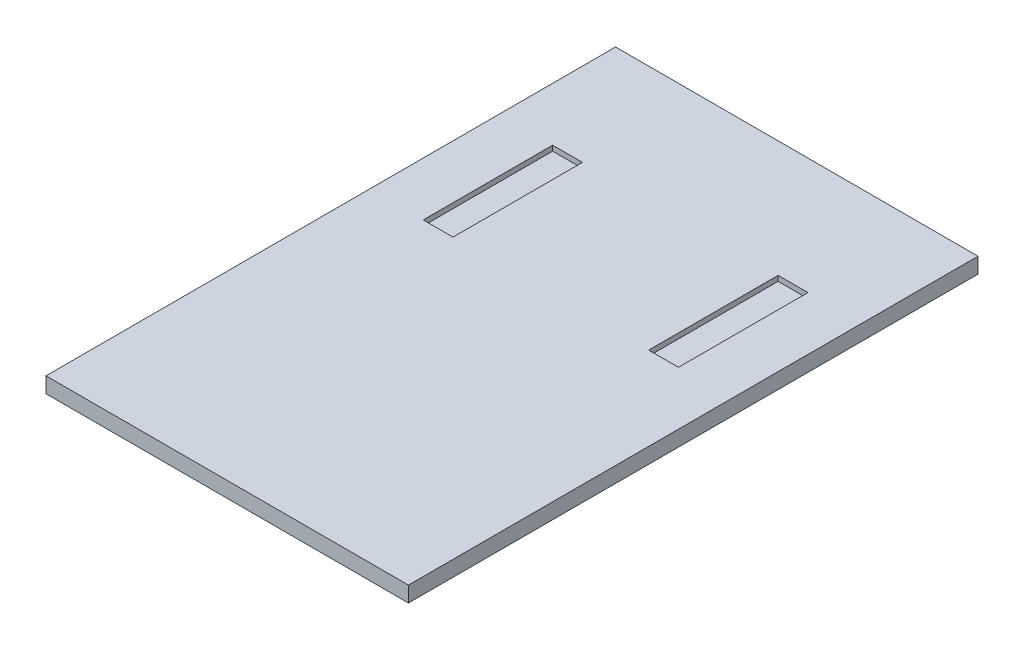
ISO-10303-21;
HEADER;
FILE_DESCRIPTION(('STEP AP214'),'2;1');
FILE_NAME('part.step','',(''),(''),'','','');
FILE_SCHEMA(('AUTOMOTIVE_DESIGN { 1 0 10303 214 1 1 1 1 }'));
ENDSEC;
DATA;
#1=APPLICATION_CONTEXT('core data for automotive mechanical design processes');
#2=APPLICATION_PROTOCOL_DEFINITION('international standard','automotive_design',2000,#1);
#3=PRODUCT_CONTEXT('',#1,'mechanical');
#4=PRODUCT('Part','Part','',(#3));
#5=PRODUCT_RELATED_PRODUCT_CATEGORY('part','',(#4));
#6=PRODUCT_DEFINITION_FORMATION('','',#4);
#7=PRODUCT_DEFINITION_CONTEXT('part definition',#1,'design');
#8=PRODUCT_DEFINITION('design','',#6,#7);
#9=PRODUCT_DEFINITION_SHAPE('','',#8);
#10=(LENGTH_UNIT() NAMED_UNIT(*) SI_UNIT(.MILLI.,.METRE.));
#11=(NAMED_UNIT(*) PLANE_ANGLE_UNIT() SI_UNIT($,.RADIAN.));
#12=(NAMED_UNIT(*) SI_UNIT($,.STERADIAN.) SOLID_ANGLE_UNIT());
#13=UNCERTAINTY_MEASURE_WITH_UNIT(LENGTH_MEASURE(1.E-05),#10,'distance_accuracy_value','');
#14=(GEOMETRIC_REPRESENTATION_CONTEXT(3) GLOBAL_UNCERTAINTY_ASSIGNED_CONTEXT((#13)) GLOBAL_UNIT_ASSIGNED_CONTEXT((#10,
#11,#12)) REPRESENTATION_CONTEXT('',''));
#15=CARTESIAN_POINT('',(0.,0.,0.));
#16=DIRECTION('',(0.,0.,1.));
#17=DIRECTION('',(1.,0.,0.));
#18=AXIS2_PLACEMENT_3D('',#15,#16,#17);
#19=CARTESIAN_POINT('',(889.,76.2,1397.));
#20=DIRECTION('',(-1.,0.,0.));
#21=DIRECTION('',(0.,0.,1.));
#22=AXIS2_PLACEMENT_3D('',#19,#20,#21);
#23=PLANE('',#22);
#24=DIRECTION('',(0.,0.,-1.));
#25=VECTOR('',#24,1.);
#26=CARTESIAN_POINT('',(889.,0.,1397.));
#27=LINE('',#26,#25);
#28=CARTESIAN_POINT('',(889.,0.,1397.));
#29=VERTEX_POINT('',#28);
#30=CARTESIAN_POINT('',(889.,0.,-1397.));
#31=VERTEX_POINT('',#30);
#32=EDGE_CURVE('E159',#29,#31,#27,.T.);
#33=ORIENTED_EDGE('',*,*,#32,.T.);
#34=DIRECTION('',(0.,-1.,0.));
#35=VECTOR('',#34,1.);
#36=CARTESIAN_POINT('',(889.,76.2,-1397.));
#37=LINE('',#36,#35);
#38=CARTESIAN_POINT('',(889.,76.2,-1397.));
#39=VERTEX_POINT('',#38);
#40=EDGE_CURVE('E11',#39,#31,#37,.T.);
#41=ORIENTED_EDGE('',*,*,#40,.F.);
#42=DIRECTION('',(0.,0.,-1.));
#43=VECTOR('',#42,1.);
#44=CARTESIAN_POINT('',(889.,76.2,1397.));
#45=LINE('',#44,#43);
#46=CARTESIAN_POINT('',(889.,76.2,1397.));
#47=VERTEX_POINT('',#46);
#48=EDGE_CURVE('E192',#47,#39,#45,.T.);
#49=ORIENTED_EDGE('',*,*,#48,.F.);
#50=DIRECTION('',(0.,-1.,0.));
#51=VECTOR('',#50,1.);
#52=CARTESIAN_POINT('',(889.,76.2,1397.));
#53=LINE('',#52,#51);
#54=EDGE_CURVE('E202',#47,#29,#53,.T.);
#55=ORIENTED_EDGE('',*,*,#54,.T.);
#56=EDGE_LOOP('',(#33,#41,#49,#55));
#57=FACE_BOUND('',#56,.T.);
#58=ADVANCED_FACE('F35',(#57),#23,.F.);
#59=CARTESIAN_POINT('',(-889.,76.2,-1397.));
#60=DIRECTION('',(0.,0.,1.));
#61=DIRECTION('',(1.,0.,0.));
#62=AXIS2_PLACEMENT_3D('',#59,#60,#61);
#63=PLANE('',#62);
#64=DIRECTION('',(-1.,0.,0.));
#65=VECTOR('',#64,1.);
#66=CARTESIAN_POINT('',(-889.,0.,-1397.));
#67=LINE('',#66,#65);
#68=CARTESIAN_POINT('',(-889.,0.,-1397.));
#69=VERTEX_POINT('',#68);
#70=EDGE_CURVE('E205',#31,#69,#67,.T.);
#71=ORIENTED_EDGE('',*,*,#70,.T.);
#72=DIRECTION('',(0.,-1.,0.));
#73=VECTOR('',#72,1.);
#74=CARTESIAN_POINT('',(-889.,76.2,-1397.));
#75=LINE('',#74,#73);
#76=CARTESIAN_POINT('',(-889.,76.2,-1397.));
#77=VERTEX_POINT('',#76);
#78=EDGE_CURVE('E42',#77,#69,#75,.T.);
#79=ORIENTED_EDGE('',*,*,#78,.F.);
#80=DIRECTION('',(-1.,0.,0.));
#81=VECTOR('',#80,1.);
#82=CARTESIAN_POINT('',(-889.,76.2,-1397.));
#83=LINE('',#82,#81);
#84=EDGE_CURVE('E195',#39,#77,#83,.T.);
#85=ORIENTED_EDGE('',*,*,#84,.F.);
#86=ORIENTED_EDGE('',*,*,#40,.T.);
#87=EDGE_LOOP('',(#71,#79,#85,#86));
#88=FACE_BOUND('',#87,.T.);
#89=ADVANCED_FACE('F235',(#88),#63,.F.);
#90=CARTESIAN_POINT('',(-889.,76.2,1397.));
#91=DIRECTION('',(1.,0.,0.));
#92=DIRECTION('',(0.,0.,-1.));
#93=AXIS2_PLACEMENT_3D('',#90,#91,#92);
#94=PLANE('',#93);
#95=DIRECTION('',(0.,0.,1.));
#96=VECTOR('',#95,1.);
#97=CARTESIAN_POINT('',(-889.,0.,1397.));
#98=LINE('',#97,#96);
#99=CARTESIAN_POINT('',(-889.,0.,1397.));
#100=VERTEX_POINT('',#99);
#101=EDGE_CURVE('E207',#69,#100,#98,.T.);
#102=ORIENTED_EDGE('',*,*,#101,.T.);
#103=DIRECTION('',(0.,-1.,0.));
#104=VECTOR('',#103,1.);
#105=CARTESIAN_POINT('',(-889.,76.2,1397.));
#106=LINE('',#105,#104);
#107=CARTESIAN_POINT('',(-889.,76.2,1397.));
#108=VERTEX_POINT('',#107);
#109=EDGE_CURVE('E212',#108,#100,#106,.T.);
#110=ORIENTED_EDGE('',*,*,#109,.F.);
#111=DIRECTION('',(0.,0.,1.));
#112=VECTOR('',#111,1.);
#113=CARTESIAN_POINT('',(-889.,76.2,1397.));
#114=LINE('',#113,#112);
#115=EDGE_CURVE('E198',#77,#108,#114,.T.);
#116=ORIENTED_EDGE('',*,*,#115,.F.);
#117=ORIENTED_EDGE('',*,*,#78,.T.);
#118=EDGE_LOOP('',(#102,#110,#116,#117));
#119=FACE_BOUND('',#118,.T.);
#120=ADVANCED_FACE('F219',(#119),#94,.F.);
#121=CARTESIAN_POINT('',(-889.,76.2,1397.));
#122=DIRECTION('',(0.,0.,-1.));
#123=DIRECTION('',(-1.,0.,0.));
#124=AXIS2_PLACEMENT_3D('',#121,#122,#123);
#125=PLANE('',#124);
#126=DIRECTION('',(1.,0.,0.));
#127=VECTOR('',#126,1.);
#128=CARTESIAN_POINT('',(-889.,0.,1397.));
#129=LINE('',#128,#127);
#130=EDGE_CURVE('E196',#100,#29,#129,.T.);
#131=ORIENTED_EDGE('',*,*,#130,.T.);
#132=ORIENTED_EDGE('',*,*,#54,.F.);
#133=DIRECTION('',(1.,0.,0.));
#134=VECTOR('',#133,1.);
#135=CARTESIAN_POINT('',(-889.,76.2,1397.));
#136=LINE('',#135,#134);
#137=EDGE_CURVE('E200',#108,#47,#136,.T.);
#138=ORIENTED_EDGE('',*,*,#137,.F.);
#139=ORIENTED_EDGE('',*,*,#109,.T.);
#140=EDGE_LOOP('',(#131,#132,#138,#139));
#141=FACE_BOUND('',#140,.T.);
#142=ADVANCED_FACE('F228',(#141),#125,.F.);
#143=CARTESIAN_POINT('',(0.,76.2,0.));
#144=DIRECTION('',(0.,-1.,0.));
#145=DIRECTION('',(0.,0.,-1.));
#146=AXIS2_PLACEMENT_3D('',#143,#144,#145);
#147=PLANE('',#146);
#148=DIRECTION('',(1.,0.,0.));
#149=VECTOR('',#148,1.);
#150=CARTESIAN_POINT('',(626.11,76.2,-190.5));
#151=LINE('',#150,#149);
#152=CARTESIAN_POINT('',(480.06,76.2,-190.5));
#153=VERTEX_POINT('',#152);
#154=CARTESIAN_POINT('',(626.11,76.2,-190.5));
#155=VERTEX_POINT('',#154);
#156=EDGE_CURVE('E152',#153,#155,#151,.T.);
#157=ORIENTED_EDGE('',*,*,#156,.F.);
#158=DIRECTION('',(0.,0.,1.));
#159=VECTOR('',#158,1.);
#160=CARTESIAN_POINT('',(480.06,76.2,-190.5));
#161=LINE('',#160,#159);
#162=CARTESIAN_POINT('',(480.06,76.2,-825.5));
#163=VERTEX_POINT('',#162);
#164=EDGE_CURVE('E49',#163,#153,#161,.T.);
#165=ORIENTED_EDGE('',*,*,#164,.F.);
#166=DIRECTION('',(-1.,0.,0.));
#167=VECTOR('',#166,1.);
#168=CARTESIAN_POINT('',(626.11,76.2,-825.5));
#169=LINE('',#168,#167);
#170=CARTESIAN_POINT('',(626.11,76.2,-825.5));
#171=VERTEX_POINT('',#170);
#172=EDGE_CURVE('E143',#171,#163,#169,.T.);
#173=ORIENTED_EDGE('',*,*,#172,.F.);
#174=DIRECTION('',(0.,0.,-1.));
#175=VECTOR('',#174,1.);
#176=CARTESIAN_POINT('',(626.11,76.2,-190.5));
#177=LINE('',#176,#175);
#178=EDGE_CURVE('E146',#155,#171,#177,.T.);
#179=ORIENTED_EDGE('',*,*,#178,.F.);
#180=EDGE_LOOP('',(#157,#165,#173,#179));
#181=FACE_BOUND('',#180,.T.);
#182=DIRECTION('',(1.,0.,0.));
#183=VECTOR('',#182,1.);
#184=CARTESIAN_POINT('',(-626.11,76.2,-190.5));
#185=LINE('',#184,#183);
#186=CARTESIAN_POINT('',(-626.11,76.2,-190.5));
#187=VERTEX_POINT('',#186);
#188=CARTESIAN_POINT('',(-480.06,76.2,-190.5));
#189=VERTEX_POINT('',#188);
#190=EDGE_CURVE('E178',#187,#189,#185,.T.);
#191=ORIENTED_EDGE('',*,*,#190,.F.);
#192=DIRECTION('',(0.,0.,1.));
#193=VECTOR('',#192,1.);
#194=CARTESIAN_POINT('',(-626.11,76.2,-190.5));
#195=LINE('',#194,#193);
#196=CARTESIAN_POINT('',(-626.11,76.2,-825.5));
#197=VERTEX_POINT('',#196);
#198=EDGE_CURVE('E57',#197,#187,#195,.T.);
#199=ORIENTED_EDGE('',*,*,#198,.F.);
#200=DIRECTION('',(-1.,0.,0.));
#201=VECTOR('',#200,1.);
#202=CARTESIAN_POINT('',(-626.11,76.2,-825.5));
#203=LINE('',#202,#201);
#204=CARTESIAN_POINT('',(-480.06,76.2,-825.5));
#205=VERTEX_POINT('',#204);
#206=EDGE_CURVE('E167',#205,#197,#203,.T.);
#207=ORIENTED_EDGE('',*,*,#206,.F.);
#208=DIRECTION('',(0.,0.,-1.));
#209=VECTOR('',#208,1.);
#210=CARTESIAN_POINT('',(-480.06,76.2,-190.5));
#211=LINE('',#210,#209);
#212=EDGE_CURVE('E181',#189,#205,#211,.T.);
#213=ORIENTED_EDGE('',*,*,#212,.F.);
#214=EDGE_LOOP('',(#191,#199,#207,#213));
#215=FACE_BOUND('',#214,.T.);
#216=ORIENTED_EDGE('',*,*,#48,.T.);
#217=ORIENTED_EDGE('',*,*,#84,.T.);
#218=ORIENTED_EDGE('',*,*,#115,.T.);
#219=ORIENTED_EDGE('',*,*,#137,.T.);
#220=EDGE_LOOP('',(#216,#217,#218,#219));
#221=FACE_BOUND('',#220,.T.);
#222=ADVANCED_FACE('F234',(#181,#215,#221),#147,.F.);
#223=CARTESIAN_POINT('',(0.,0.,0.));
#224=DIRECTION('',(0.,-1.,0.));
#225=DIRECTION('',(0.,0.,-1.));
#226=AXIS2_PLACEMENT_3D('',#223,#224,#225);
#227=PLANE('',#226);
#228=ORIENTED_EDGE('',*,*,#32,.F.);
#229=ORIENTED_EDGE('',*,*,#130,.F.);
#230=ORIENTED_EDGE('',*,*,#101,.F.);
#231=ORIENTED_EDGE('',*,*,#70,.F.);
#232=EDGE_LOOP('',(#228,#229,#230,#231));
#233=FACE_BOUND('',#232,.T.);
#234=ADVANCED_FACE('F225',(#233),#227,.T.);
#235=CARTESIAN_POINT('',(-626.11,50.8,-190.5));
#236=DIRECTION('',(-1.,0.,0.));
#237=DIRECTION('',(0.,0.,1.));
#238=AXIS2_PLACEMENT_3D('',#235,#236,#237);
#239=PLANE('',#238);
#240=ORIENTED_EDGE('',*,*,#198,.T.);
#241=DIRECTION('',(0.,1.,0.));
#242=VECTOR('',#241,1.);
#243=CARTESIAN_POINT('',(-626.11,50.8,-190.5));
#244=LINE('',#243,#242);
#245=CARTESIAN_POINT('',(-626.11,50.8,-190.5));
#246=VERTEX_POINT('',#245);
#247=EDGE_CURVE('E176',#246,#187,#244,.T.);
#248=ORIENTED_EDGE('',*,*,#247,.F.);
#249=DIRECTION('',(0.,0.,1.));
#250=VECTOR('',#249,1.);
#251=CARTESIAN_POINT('',(-626.11,50.8,-190.5));
#252=LINE('',#251,#250);
#253=CARTESIAN_POINT('',(-626.11,50.8,-825.5));
#254=VERTEX_POINT('',#253);
#255=EDGE_CURVE('E163',#254,#246,#252,.T.);
#256=ORIENTED_EDGE('',*,*,#255,.F.);
#257=DIRECTION('',(0.,1.,0.));
#258=VECTOR('',#257,1.);
#259=CARTESIAN_POINT('',(-626.11,50.8,-825.5));
#260=LINE('',#259,#258);
#261=EDGE_CURVE('E153',#254,#197,#260,.T.);
#262=ORIENTED_EDGE('',*,*,#261,.T.);
#263=EDGE_LOOP('',(#240,#248,#256,#262));
#264=FACE_BOUND('',#263,.T.);
#265=ADVANCED_FACE('F247',(#264),#239,.F.);
#266=CARTESIAN_POINT('',(-626.11,50.8,-825.5));
#267=DIRECTION('',(0.,0.,-1.));
#268=DIRECTION('',(-1.,0.,0.));
#269=AXIS2_PLACEMENT_3D('',#266,#267,#268);
#270=PLANE('',#269);
#271=ORIENTED_EDGE('',*,*,#206,.T.);
#272=ORIENTED_EDGE('',*,*,#261,.F.);
#273=DIRECTION('',(-1.,0.,0.));
#274=VECTOR('',#273,1.);
#275=CARTESIAN_POINT('',(-626.11,50.8,-825.5));
#276=LINE('',#275,#274);
#277=CARTESIAN_POINT('',(-480.06,50.8,-825.5));
#278=VERTEX_POINT('',#277);
#279=EDGE_CURVE('E173',#278,#254,#276,.T.);
#280=ORIENTED_EDGE('',*,*,#279,.F.);
#281=DIRECTION('',(0.,1.,0.));
#282=VECTOR('',#281,1.);
#283=CARTESIAN_POINT('',(-480.06,50.8,-825.5));
#284=LINE('',#283,#282);
#285=EDGE_CURVE('E187',#278,#205,#284,.T.);
#286=ORIENTED_EDGE('',*,*,#285,.T.);
#287=EDGE_LOOP('',(#271,#272,#280,#286));
#288=FACE_BOUND('',#287,.T.);
#289=ADVANCED_FACE('F253',(#288),#270,.F.);
#290=CARTESIAN_POINT('',(-480.06,50.8,-190.5));
#291=DIRECTION('',(1.,0.,0.));
#292=DIRECTION('',(0.,0.,-1.));
#293=AXIS2_PLACEMENT_3D('',#290,#291,#292);
#294=PLANE('',#293);
#295=ORIENTED_EDGE('',*,*,#212,.T.);
#296=ORIENTED_EDGE('',*,*,#285,.F.);
#297=DIRECTION('',(0.,0.,-1.));
#298=VECTOR('',#297,1.);
#299=CARTESIAN_POINT('',(-480.06,50.8,-190.5));
#300=LINE('',#299,#298);
#301=CARTESIAN_POINT('',(-480.06,50.8,-190.5));
#302=VERTEX_POINT('',#301);
#303=EDGE_CURVE('E170',#302,#278,#300,.T.);
#304=ORIENTED_EDGE('',*,*,#303,.F.);
#305=DIRECTION('',(0.,1.,0.));
#306=VECTOR('',#305,1.);
#307=CARTESIAN_POINT('',(-480.06,50.8,-190.5));
#308=LINE('',#307,#306);
#309=EDGE_CURVE('E189',#302,#189,#308,.T.);
#310=ORIENTED_EDGE('',*,*,#309,.T.);
#311=EDGE_LOOP('',(#295,#296,#304,#310));
#312=FACE_BOUND('',#311,.T.);
#313=ADVANCED_FACE('F258',(#312),#294,.F.);
#314=CARTESIAN_POINT('',(-626.11,50.8,-190.5));
#315=DIRECTION('',(0.,0.,1.));
#316=DIRECTION('',(1.,0.,0.));
#317=AXIS2_PLACEMENT_3D('',#314,#315,#316);
#318=PLANE('',#317);
#319=ORIENTED_EDGE('',*,*,#190,.T.);
#320=ORIENTED_EDGE('',*,*,#309,.F.);
#321=DIRECTION('',(1.,0.,0.));
#322=VECTOR('',#321,1.);
#323=CARTESIAN_POINT('',(-626.11,50.8,-190.5));
#324=LINE('',#323,#322);
#325=EDGE_CURVE('E166',#246,#302,#324,.T.);
#326=ORIENTED_EDGE('',*,*,#325,.F.);
#327=ORIENTED_EDGE('',*,*,#247,.T.);
#328=EDGE_LOOP('',(#319,#320,#326,#327));
#329=FACE_BOUND('',#328,.T.);
#330=ADVANCED_FACE('F254',(#329),#318,.F.);
#331=CARTESIAN_POINT('',(0.,50.8,0.));
#332=DIRECTION('',(0.,-1.,0.));
#333=DIRECTION('',(0.,0.,-1.));
#334=AXIS2_PLACEMENT_3D('',#331,#332,#333);
#335=PLANE('',#334);
#336=ORIENTED_EDGE('',*,*,#255,.T.);
#337=ORIENTED_EDGE('',*,*,#325,.T.);
#338=ORIENTED_EDGE('',*,*,#303,.T.);
#339=ORIENTED_EDGE('',*,*,#279,.T.);
#340=EDGE_LOOP('',(#336,#337,#338,#339));
#341=FACE_BOUND('',#340,.T.);
#342=ADVANCED_FACE('F257',(#341),#335,.F.);
#343=CARTESIAN_POINT('',(480.06,50.8,-190.5));
#344=DIRECTION('',(-1.,0.,0.));
#345=DIRECTION('',(0.,0.,1.));
#346=AXIS2_PLACEMENT_3D('',#343,#344,#345);
#347=PLANE('',#346);
#348=ORIENTED_EDGE('',*,*,#164,.T.);
#349=DIRECTION('',(0.,1.,0.));
#350=VECTOR('',#349,1.);
#351=CARTESIAN_POINT('',(480.06,50.8,-190.5));
#352=LINE('',#351,#350);
#353=CARTESIAN_POINT('',(480.06,50.8,-190.5));
#354=VERTEX_POINT('',#353);
#355=EDGE_CURVE('E121',#354,#153,#352,.T.);
#356=ORIENTED_EDGE('',*,*,#355,.F.);
#357=DIRECTION('',(0.,0.,1.));
#358=VECTOR('',#357,1.);
#359=CARTESIAN_POINT('',(480.06,50.8,-190.5));
#360=LINE('',#359,#358);
#361=CARTESIAN_POINT('',(480.06,50.8,-825.5));
#362=VERTEX_POINT('',#361);
#363=EDGE_CURVE('E125',#362,#354,#360,.T.);
#364=ORIENTED_EDGE('',*,*,#363,.F.);
#365=DIRECTION('',(0.,1.,0.));
#366=VECTOR('',#365,1.);
#367=CARTESIAN_POINT('',(480.06,50.8,-825.5));
#368=LINE('',#367,#366);
#369=EDGE_CURVE('E157',#362,#163,#368,.T.);
#370=ORIENTED_EDGE('',*,*,#369,.T.);
#371=EDGE_LOOP('',(#348,#356,#364,#370));
#372=FACE_BOUND('',#371,.T.);
#373=ADVANCED_FACE('F123',(#372),#347,.F.);
#374=CARTESIAN_POINT('',(626.11,50.8,-825.5));
#375=DIRECTION('',(0.,0.,-1.));
#376=DIRECTION('',(-1.,0.,0.));
#377=AXIS2_PLACEMENT_3D('',#374,#375,#376);
#378=PLANE('',#377);
#379=ORIENTED_EDGE('',*,*,#172,.T.);
#380=ORIENTED_EDGE('',*,*,#369,.F.);
#381=DIRECTION('',(-1.,0.,0.));
#382=VECTOR('',#381,1.);
#383=CARTESIAN_POINT('',(626.11,50.8,-825.5));
#384=LINE('',#383,#382);
#385=CARTESIAN_POINT('',(626.11,50.8,-825.5));
#386=VERTEX_POINT('',#385);
#387=EDGE_CURVE('E131',#386,#362,#384,.T.);
#388=ORIENTED_EDGE('',*,*,#387,.F.);
#389=DIRECTION('',(0.,1.,0.));
#390=VECTOR('',#389,1.);
#391=CARTESIAN_POINT('',(626.11,50.8,-825.5));
#392=LINE('',#391,#390);
#393=EDGE_CURVE('E160',#386,#171,#392,.T.);
#394=ORIENTED_EDGE('',*,*,#393,.T.);
#395=EDGE_LOOP('',(#379,#380,#388,#394));
#396=FACE_BOUND('',#395,.T.);
#397=ADVANCED_FACE('F271',(#396),#378,.F.);
#398=CARTESIAN_POINT('',(626.11,50.8,-190.5));
#399=DIRECTION('',(1.,0.,0.));
#400=DIRECTION('',(0.,0.,-1.));
#401=AXIS2_PLACEMENT_3D('',#398,#399,#400);
#402=PLANE('',#401);
#403=ORIENTED_EDGE('',*,*,#178,.T.);
#404=ORIENTED_EDGE('',*,*,#393,.F.);
#405=DIRECTION('',(0.,0.,-1.));
#406=VECTOR('',#405,1.);
#407=CARTESIAN_POINT('',(626.11,50.8,-190.5));
#408=LINE('',#407,#406);
#409=CARTESIAN_POINT('',(626.11,50.8,-190.5));
#410=VERTEX_POINT('',#409);
#411=EDGE_CURVE('E139',#410,#386,#408,.T.);
#412=ORIENTED_EDGE('',*,*,#411,.F.);
#413=DIRECTION('',(0.,1.,0.));
#414=VECTOR('',#413,1.);
#415=CARTESIAN_POINT('',(626.11,50.8,-190.5));
#416=LINE('',#415,#414);
#417=EDGE_CURVE('E130',#410,#155,#416,.T.);
#418=ORIENTED_EDGE('',*,*,#417,.T.);
#419=EDGE_LOOP('',(#403,#404,#412,#418));
#420=FACE_BOUND('',#419,.T.);
#421=ADVANCED_FACE('F274',(#420),#402,.F.);
#422=CARTESIAN_POINT('',(626.11,50.8,-190.5));
#423=DIRECTION('',(0.,0.,1.));
#424=DIRECTION('',(1.,0.,0.));
#425=AXIS2_PLACEMENT_3D('',#422,#423,#424);
#426=PLANE('',#425);
#427=ORIENTED_EDGE('',*,*,#156,.T.);
#428=ORIENTED_EDGE('',*,*,#417,.F.);
#429=DIRECTION('',(1.,0.,0.));
#430=VECTOR('',#429,1.);
#431=CARTESIAN_POINT('',(626.11,50.8,-190.5));
#432=LINE('',#431,#430);
#433=EDGE_CURVE('E134',#354,#410,#432,.T.);
#434=ORIENTED_EDGE('',*,*,#433,.F.);
#435=ORIENTED_EDGE('',*,*,#355,.T.);
#436=EDGE_LOOP('',(#427,#428,#434,#435));
#437=FACE_BOUND('',#436,.T.);
#438=ADVANCED_FACE('F135',(#437),#426,.F.);
#439=CARTESIAN_POINT('',(0.,50.8,0.));
#440=DIRECTION('',(0.,1.,0.));
#441=DIRECTION('',(0.,0.,1.));
#442=AXIS2_PLACEMENT_3D('',#439,#440,#441);
#443=PLANE('',#442);
#444=ORIENTED_EDGE('',*,*,#363,.T.);
#445=ORIENTED_EDGE('',*,*,#433,.T.);
#446=ORIENTED_EDGE('',*,*,#411,.T.);
#447=ORIENTED_EDGE('',*,*,#387,.T.);
#448=EDGE_LOOP('',(#444,#445,#446,#447));
#449=FACE_BOUND('',#448,.T.);
#450=ADVANCED_FACE('F141',(#449),#443,.T.);
#451=CLOSED_SHELL('',(#58,#89,#120,#142,#222,#234,#265,#289,#313,#330,#342,#373,#397,#421,#438,#450));
#452=MANIFOLD_SOLID_BREP('B2',#451);
#453=ADVANCED_BREP_SHAPE_REPRESENTATION('',(#18,#452),#14);
#454=SHAPE_DEFINITION_REPRESENTATION(#9,#453);
ENDSEC;
END-ISO-10303-21;
